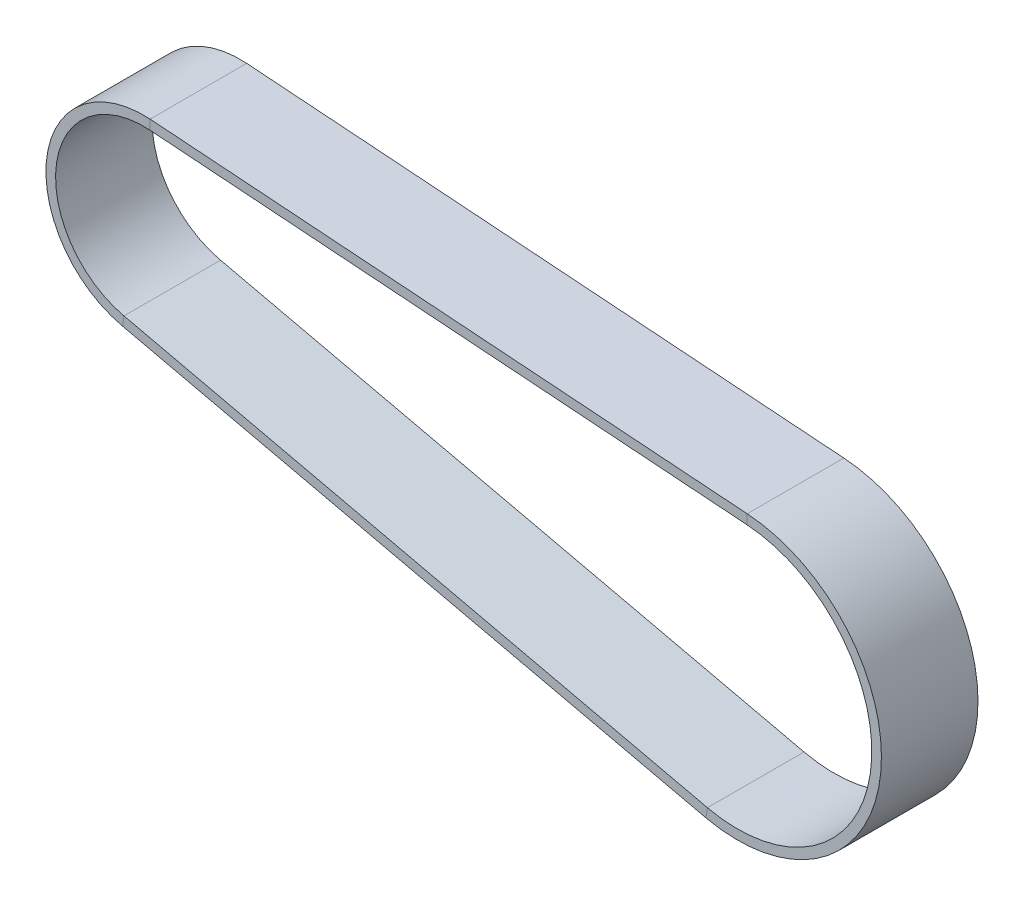
ISO-10303-21;
HEADER;
FILE_DESCRIPTION(('STEP AP214'),'2;1');
FILE_NAME('part.step','',(''),(''),'','','');
FILE_SCHEMA(('AUTOMOTIVE_DESIGN { 1 0 10303 214 1 1 1 1 }'));
ENDSEC;
DATA;
#1=APPLICATION_CONTEXT('core data for automotive mechanical design processes');
#2=APPLICATION_PROTOCOL_DEFINITION('international standard','automotive_design',2000,#1);
#3=PRODUCT_CONTEXT('',#1,'mechanical');
#4=PRODUCT('Part','Part','',(#3));
#5=PRODUCT_RELATED_PRODUCT_CATEGORY('part','',(#4));
#6=PRODUCT_DEFINITION_FORMATION('','',#4);
#7=PRODUCT_DEFINITION_CONTEXT('part definition',#1,'design');
#8=PRODUCT_DEFINITION('design','',#6,#7);
#9=PRODUCT_DEFINITION_SHAPE('','',#8);
#10=(LENGTH_UNIT() NAMED_UNIT(*) SI_UNIT(.MILLI.,.METRE.));
#11=(NAMED_UNIT(*) PLANE_ANGLE_UNIT() SI_UNIT($,.RADIAN.));
#12=(NAMED_UNIT(*) SI_UNIT($,.STERADIAN.) SOLID_ANGLE_UNIT());
#13=UNCERTAINTY_MEASURE_WITH_UNIT(LENGTH_MEASURE(1.E-05),#10,'distance_accuracy_value','');
#14=(GEOMETRIC_REPRESENTATION_CONTEXT(3) GLOBAL_UNCERTAINTY_ASSIGNED_CONTEXT((#13)) GLOBAL_UNIT_ASSIGNED_CONTEXT((#10,
#11,#12)) REPRESENTATION_CONTEXT('',''));
#15=CARTESIAN_POINT('',(0.,0.,0.));
#16=DIRECTION('',(0.,0.,1.));
#17=DIRECTION('',(1.,0.,0.));
#18=AXIS2_PLACEMENT_3D('',#15,#16,#17);
#19=CARTESIAN_POINT('',(1.33504318711175E-11,-2.84043621956442E-11,0.));
#20=DIRECTION('',(0.,0.,-1.));
#21=DIRECTION('',(-1.,0.,0.));
#22=AXIS2_PLACEMENT_3D('',#19,#20,#21);
#23=CYLINDRICAL_SURFACE('',#22,10.1276459482546);
#24=CARTESIAN_POINT('',(1.33504318711175E-11,-2.84043621956442E-11,-5.));
#25=DIRECTION('',(0.,0.,-1.));
#26=DIRECTION('',(-0.217155513280798,-0.97613702063376,0.));
#27=AXIS2_PLACEMENT_3D('',#24,#25,#26);
#28=CIRCLE('',#27,10.1276459482546);
#29=CARTESIAN_POINT('',(-2.19927415421774,-9.88597014204194,-5.));
#30=VERTEX_POINT('',#29);
#31=CARTESIAN_POINT('',(0.659407883699955,10.1061562275979,-5.));
#32=VERTEX_POINT('',#31);
#33=EDGE_CURVE('E11',#30,#32,#28,.T.);
#34=ORIENTED_EDGE('',*,*,#33,.F.);
#35=DIRECTION('',(0.,0.,1.));
#36=VECTOR('',#35,1.);
#37=CARTESIAN_POINT('',(-2.19927415420607,-9.88597014199121,5.));
#38=LINE('',#37,#36);
#39=CARTESIAN_POINT('',(-2.19927415421774,-9.88597014204193,5.));
#40=VERTEX_POINT('',#39);
#41=EDGE_CURVE('E46',#30,#40,#38,.T.);
#42=ORIENTED_EDGE('',*,*,#41,.T.);
#43=CARTESIAN_POINT('',(1.33504318711175E-11,-2.84043621956442E-11,5.));
#44=DIRECTION('',(0.,0.,-1.));
#45=DIRECTION('',(-0.217155513280799,-0.97613702063376,0.));
#46=AXIS2_PLACEMENT_3D('',#43,#44,#45);
#47=CIRCLE('',#46,10.1276459482546);
#48=CARTESIAN_POINT('',(0.659407883699955,10.1061562275979,5.));
#49=VERTEX_POINT('',#48);
#50=EDGE_CURVE('E125',#40,#49,#47,.T.);
#51=ORIENTED_EDGE('',*,*,#50,.T.);
#52=DIRECTION('',(0.,0.,1.));
#53=VECTOR('',#52,1.);
#54=CARTESIAN_POINT('',(0.659407883699955,10.1061562275979,5.));
#55=LINE('',#54,#53);
#56=EDGE_CURVE('E123',#32,#49,#55,.T.);
#57=ORIENTED_EDGE('',*,*,#56,.F.);
#58=EDGE_LOOP('',(#34,#42,#51,#57));
#59=FACE_BOUND('',#58,.T.);
#60=ADVANCED_FACE('F43',(#59),#23,.T.);
#61=CARTESIAN_POINT('',(-2.19927415420607,-9.88597014199121,-5.));
#62=DIRECTION('',(0.,0.,-1.));
#63=DIRECTION('',(-1.,0.,0.));
#64=AXIS2_PLACEMENT_3D('',#61,#62,#63);
#65=PLANE('',#64);
#66=CARTESIAN_POINT('',(1.33504318711175E-11,-2.84043621956442E-11,-5.));
#67=DIRECTION('',(0.,0.,-1.));
#68=DIRECTION('',(-0.22411121564276,-0.97456357567022,0.));
#69=AXIS2_PLACEMENT_3D('',#66,#67,#68);
#70=CIRCLE('',#69,9.12999999989343);
#71=CARTESIAN_POINT('',(-2.04613539879283,-8.89776544584438,-5.));
#72=VERTEX_POINT('',#71);
#73=CARTESIAN_POINT('',(0.659407883699955,9.10615622759785,-5.));
#74=VERTEX_POINT('',#73);
#75=EDGE_CURVE('E51',#72,#74,#70,.T.);
#76=ORIENTED_EDGE('',*,*,#75,.F.);
#77=DIRECTION('',(-0.153138755424914,-0.988204696197558,0.));
#78=VECTOR('',#77,1.);
#79=CARTESIAN_POINT('',(-2.19927415420607,-9.88597014199121,-5.));
#80=LINE('',#79,#78);
#81=EDGE_CURVE('E192',#72,#30,#80,.T.);
#82=ORIENTED_EDGE('',*,*,#81,.T.);
#83=ORIENTED_EDGE('',*,*,#33,.T.);
#84=DIRECTION('',(0.,1.,0.));
#85=VECTOR('',#84,1.);
#86=CARTESIAN_POINT('',(0.659407883699955,10.1061562275979,-5.));
#87=LINE('',#86,#85);
#88=EDGE_CURVE('E148',#74,#32,#87,.T.);
#89=ORIENTED_EDGE('',*,*,#88,.F.);
#90=EDGE_LOOP('',(#76,#82,#83,#89));
#91=FACE_BOUND('',#90,.T.);
#92=ADVANCED_FACE('F234',(#91),#65,.T.);
#93=CARTESIAN_POINT('',(1.33504318711175E-11,-2.84043621956442E-11,0.));
#94=DIRECTION('',(0.,0.,-1.));
#95=DIRECTION('',(-1.,0.,0.));
#96=AXIS2_PLACEMENT_3D('',#93,#94,#95);
#97=CYLINDRICAL_SURFACE('',#96,9.12999999989343);
#98=CARTESIAN_POINT('',(1.33504318711175E-11,-2.84043621956442E-11,5.));
#99=DIRECTION('',(0.,0.,-1.));
#100=DIRECTION('',(-0.22411121564276,-0.97456357567022,0.));
#101=AXIS2_PLACEMENT_3D('',#98,#99,#100);
#102=CIRCLE('',#101,9.12999999989343);
#103=CARTESIAN_POINT('',(-2.04613539879283,-8.89776544584438,5.));
#104=VERTEX_POINT('',#103);
#105=CARTESIAN_POINT('',(0.659407883699955,9.10615622759785,5.));
#106=VERTEX_POINT('',#105);
#107=EDGE_CURVE('E133',#104,#106,#102,.T.);
#108=ORIENTED_EDGE('',*,*,#107,.F.);
#109=DIRECTION('',(0.,0.,-1.));
#110=VECTOR('',#109,1.);
#111=CARTESIAN_POINT('',(-2.04613539878116,-8.89776544579365,5.));
#112=LINE('',#111,#110);
#113=EDGE_CURVE('E176',#104,#72,#112,.T.);
#114=ORIENTED_EDGE('',*,*,#113,.T.);
#115=ORIENTED_EDGE('',*,*,#75,.T.);
#116=DIRECTION('',(0.,0.,-1.));
#117=VECTOR('',#116,1.);
#118=CARTESIAN_POINT('',(0.659407883699955,9.10615622759785,5.));
#119=LINE('',#118,#117);
#120=EDGE_CURVE('E152',#106,#74,#119,.T.);
#121=ORIENTED_EDGE('',*,*,#120,.F.);
#122=EDGE_LOOP('',(#108,#114,#115,#121));
#123=FACE_BOUND('',#122,.T.);
#124=ADVANCED_FACE('F238',(#123),#97,.F.);
#125=CARTESIAN_POINT('',(58.2177782861639,-23.779511215972,5.));
#126=DIRECTION('',(-0.224111215639051,-0.974563575671073,0.));
#127=DIRECTION('',(0.974563575671073,-0.224111215639051,0.));
#128=AXIS2_PLACEMENT_3D('',#125,#126,#127);
#129=PLANE('',#128);
#130=ORIENTED_EDGE('',*,*,#41,.F.);
#131=DIRECTION('',(-0.974563575671073,0.224111215639051,0.));
#132=VECTOR('',#131,1.);
#133=CARTESIAN_POINT('',(58.2177782861639,-23.779511215972,-5.));
#134=LINE('',#133,#132);
#135=CARTESIAN_POINT('',(58.2177782861639,-23.779511215972,-5.));
#136=VERTEX_POINT('',#135);
#137=EDGE_CURVE('E204',#136,#30,#134,.T.);
#138=ORIENTED_EDGE('',*,*,#137,.F.);
#139=DIRECTION('',(0.,0.,1.));
#140=VECTOR('',#139,1.);
#141=CARTESIAN_POINT('',(58.2177782861639,-23.779511215972,5.));
#142=LINE('',#141,#140);
#143=CARTESIAN_POINT('',(58.2177782861639,-23.779511215972,5.));
#144=VERTEX_POINT('',#143);
#145=EDGE_CURVE('E177',#136,#144,#142,.T.);
#146=ORIENTED_EDGE('',*,*,#145,.T.);
#147=DIRECTION('',(-0.974563575671073,0.224111215639051,0.));
#148=VECTOR('',#147,1.);
#149=CARTESIAN_POINT('',(58.2177782861639,-23.779511215972,5.));
#150=LINE('',#149,#148);
#151=EDGE_CURVE('E173',#144,#40,#150,.T.);
#152=ORIENTED_EDGE('',*,*,#151,.T.);
#153=EDGE_LOOP('',(#130,#138,#146,#152));
#154=FACE_BOUND('',#153,.T.);
#155=ADVANCED_FACE('F214',(#154),#129,.T.);
#156=CARTESIAN_POINT('',(58.2177782861639,-23.779511215972,-5.));
#157=DIRECTION('',(0.,0.,-1.));
#158=DIRECTION('',(-1.,0.,0.));
#159=AXIS2_PLACEMENT_3D('',#156,#157,#158);
#160=PLANE('',#159);
#161=ORIENTED_EDGE('',*,*,#137,.T.);
#162=ORIENTED_EDGE('',*,*,#81,.F.);
#163=DIRECTION('',(-0.974563575671073,0.224111215639051,0.));
#164=VECTOR('',#163,1.);
#165=CARTESIAN_POINT('',(58.3709170415888,-22.7913065197744,-5.));
#166=LINE('',#165,#164);
#167=CARTESIAN_POINT('',(58.3709170415888,-22.7913065197744,-5.));
#168=VERTEX_POINT('',#167);
#169=EDGE_CURVE('E191',#168,#72,#166,.T.);
#170=ORIENTED_EDGE('',*,*,#169,.F.);
#171=DIRECTION('',(-0.153138755424915,-0.988204696197558,0.));
#172=VECTOR('',#171,1.);
#173=CARTESIAN_POINT('',(58.2177782861639,-23.779511215972,-5.));
#174=LINE('',#173,#172);
#175=EDGE_CURVE('E189',#168,#136,#174,.T.);
#176=ORIENTED_EDGE('',*,*,#175,.T.);
#177=EDGE_LOOP('',(#161,#162,#170,#176));
#178=FACE_BOUND('',#177,.T.);
#179=ADVANCED_FACE('F250',(#178),#160,.T.);
#180=CARTESIAN_POINT('',(58.3709170415888,-22.7913065197744,5.));
#181=DIRECTION('',(0.224111215639051,0.974563575671073,0.));
#182=DIRECTION('',(-0.974563575671073,0.224111215639051,0.));
#183=AXIS2_PLACEMENT_3D('',#180,#181,#182);
#184=PLANE('',#183);
#185=ORIENTED_EDGE('',*,*,#169,.T.);
#186=ORIENTED_EDGE('',*,*,#113,.F.);
#187=DIRECTION('',(-0.974563575671073,0.224111215639051,0.));
#188=VECTOR('',#187,1.);
#189=CARTESIAN_POINT('',(58.3709170415888,-22.7913065197744,5.));
#190=LINE('',#189,#188);
#191=CARTESIAN_POINT('',(58.3709170415888,-22.7913065197744,5.));
#192=VERTEX_POINT('',#191);
#193=EDGE_CURVE('E175',#192,#104,#190,.T.);
#194=ORIENTED_EDGE('',*,*,#193,.F.);
#195=DIRECTION('',(0.,0.,-1.));
#196=VECTOR('',#195,1.);
#197=CARTESIAN_POINT('',(58.3709170415888,-22.7913065197744,5.));
#198=LINE('',#197,#196);
#199=EDGE_CURVE('E164',#192,#168,#198,.T.);
#200=ORIENTED_EDGE('',*,*,#199,.T.);
#201=EDGE_LOOP('',(#185,#186,#194,#200));
#202=FACE_BOUND('',#201,.T.);
#203=ADVANCED_FACE('F220',(#202),#184,.T.);
#204=CARTESIAN_POINT('',(58.2177782861639,-23.779511215972,5.));
#205=DIRECTION('',(0.,0.,1.));
#206=DIRECTION('',(1.,0.,0.));
#207=AXIS2_PLACEMENT_3D('',#204,#205,#206);
#208=PLANE('',#207);
#209=ORIENTED_EDGE('',*,*,#193,.T.);
#210=DIRECTION('',(0.153138755424914,0.988204696197558,0.));
#211=VECTOR('',#210,1.);
#212=CARTESIAN_POINT('',(-2.19927415420607,-9.88597014199121,5.));
#213=LINE('',#212,#211);
#214=EDGE_CURVE('E167',#40,#104,#213,.T.);
#215=ORIENTED_EDGE('',*,*,#214,.F.);
#216=ORIENTED_EDGE('',*,*,#151,.F.);
#217=DIRECTION('',(0.153138755424915,0.988204696197558,0.));
#218=VECTOR('',#217,1.);
#219=CARTESIAN_POINT('',(58.2177782861639,-23.779511215972,5.));
#220=LINE('',#219,#218);
#221=EDGE_CURVE('E162',#144,#192,#220,.T.);
#222=ORIENTED_EDGE('',*,*,#221,.T.);
#223=EDGE_LOOP('',(#209,#215,#216,#222));
#224=FACE_BOUND('',#223,.T.);
#225=ADVANCED_FACE('F218',(#224),#208,.T.);
#226=CARTESIAN_POINT('',(61.4871834950631,-9.24000000001022,0.));
#227=DIRECTION('',(0.,0.,-1.));
#228=DIRECTION('',(-1.,0.,0.));
#229=AXIS2_PLACEMENT_3D('',#226,#227,#228);
#230=CYLINDRICAL_SURFACE('',#229,14.9025634311368);
#231=ORIENTED_EDGE('',*,*,#145,.F.);
#232=CARTESIAN_POINT('',(61.4871834950631,-9.24000000001022,-5.));
#233=DIRECTION('',(0.,0.,-1.));
#234=DIRECTION('',(0.067389676531067,0.997726731874534,0.));
#235=AXIS2_PLACEMENT_3D('',#232,#233,#234);
#236=CIRCLE('',#235,14.9025634311368);
#237=CARTESIAN_POINT('',(62.4914624241711,5.62868590869084,-5.));
#238=VERTEX_POINT('',#237);
#239=EDGE_CURVE('E89',#238,#136,#236,.T.);
#240=ORIENTED_EDGE('',*,*,#239,.F.);
#241=DIRECTION('',(0.,0.,1.));
#242=VECTOR('',#241,1.);
#243=CARTESIAN_POINT('',(62.4914624241711,5.62868590869084,5.));
#244=LINE('',#243,#242);
#245=CARTESIAN_POINT('',(62.4914624241711,5.62868590869084,5.));
#246=VERTEX_POINT('',#245);
#247=EDGE_CURVE('E169',#238,#246,#244,.T.);
#248=ORIENTED_EDGE('',*,*,#247,.T.);
#249=CARTESIAN_POINT('',(61.4871834950631,-9.24000000001022,5.));
#250=DIRECTION('',(0.,0.,-1.));
#251=DIRECTION('',(0.067389676531067,0.997726731874534,0.));
#252=AXIS2_PLACEMENT_3D('',#249,#250,#251);
#253=CIRCLE('',#252,14.9025634311368);
#254=EDGE_CURVE('E170',#246,#144,#253,.T.);
#255=ORIENTED_EDGE('',*,*,#254,.T.);
#256=EDGE_LOOP('',(#231,#240,#248,#255));
#257=FACE_BOUND('',#256,.T.);
#258=ADVANCED_FACE('F230',(#257),#230,.T.);
#259=CARTESIAN_POINT('',(62.4914624241711,5.62868590869084,-5.));
#260=DIRECTION('',(0.,0.,-1.));
#261=DIRECTION('',(-1.,0.,0.));
#262=AXIS2_PLACEMENT_3D('',#259,#260,#261);
#263=PLANE('',#262);
#264=ORIENTED_EDGE('',*,*,#239,.T.);
#265=ORIENTED_EDGE('',*,*,#175,.F.);
#266=CARTESIAN_POINT('',(61.4871834950631,-9.24000000001022,-5.));
#267=DIRECTION('',(0.,0.,-1.));
#268=DIRECTION('',(0.072224302704331,0.997388414860967,0.));
#269=AXIS2_PLACEMENT_3D('',#266,#267,#268);
#270=CIRCLE('',#269,13.9050000000595);
#271=CARTESIAN_POINT('',(62.4914624241711,4.62868590869084,-5.));
#272=VERTEX_POINT('',#271);
#273=EDGE_CURVE('E97',#272,#168,#270,.T.);
#274=ORIENTED_EDGE('',*,*,#273,.F.);
#275=DIRECTION('',(0.,1.,0.));
#276=VECTOR('',#275,1.);
#277=CARTESIAN_POINT('',(62.4914624241711,5.62868590869084,-5.));
#278=LINE('',#277,#276);
#279=EDGE_CURVE('E184',#272,#238,#278,.T.);
#280=ORIENTED_EDGE('',*,*,#279,.T.);
#281=EDGE_LOOP('',(#264,#265,#274,#280));
#282=FACE_BOUND('',#281,.T.);
#283=ADVANCED_FACE('F225',(#282),#263,.T.);
#284=CARTESIAN_POINT('',(61.4871834950631,-9.24000000001022,0.));
#285=DIRECTION('',(0.,0.,-1.));
#286=DIRECTION('',(-1.,0.,0.));
#287=AXIS2_PLACEMENT_3D('',#284,#285,#286);
#288=CYLINDRICAL_SURFACE('',#287,13.9050000000595);
#289=ORIENTED_EDGE('',*,*,#273,.T.);
#290=ORIENTED_EDGE('',*,*,#199,.F.);
#291=CARTESIAN_POINT('',(61.4871834950631,-9.24000000001022,5.));
#292=DIRECTION('',(0.,0.,-1.));
#293=DIRECTION('',(0.072224302704331,0.997388414860967,0.));
#294=AXIS2_PLACEMENT_3D('',#291,#292,#293);
#295=CIRCLE('',#294,13.9050000000595);
#296=CARTESIAN_POINT('',(62.4914624241711,4.62868590869084,5.));
#297=VERTEX_POINT('',#296);
#298=EDGE_CURVE('E102',#297,#192,#295,.T.);
#299=ORIENTED_EDGE('',*,*,#298,.F.);
#300=DIRECTION('',(0.,0.,-1.));
#301=VECTOR('',#300,1.);
#302=CARTESIAN_POINT('',(62.4914624241711,4.62868590869084,5.));
#303=LINE('',#302,#301);
#304=EDGE_CURVE('E156',#297,#272,#303,.T.);
#305=ORIENTED_EDGE('',*,*,#304,.T.);
#306=EDGE_LOOP('',(#289,#290,#299,#305));
#307=FACE_BOUND('',#306,.T.);
#308=ADVANCED_FACE('F216',(#307),#288,.F.);
#309=CARTESIAN_POINT('',(62.4914624241711,5.62868590869084,5.));
#310=DIRECTION('',(0.,0.,1.));
#311=DIRECTION('',(1.,0.,0.));
#312=AXIS2_PLACEMENT_3D('',#309,#310,#311);
#313=PLANE('',#312);
#314=ORIENTED_EDGE('',*,*,#298,.T.);
#315=ORIENTED_EDGE('',*,*,#221,.F.);
#316=ORIENTED_EDGE('',*,*,#254,.F.);
#317=DIRECTION('',(0.,-1.,0.));
#318=VECTOR('',#317,1.);
#319=CARTESIAN_POINT('',(62.4914624241711,5.62868590869084,5.));
#320=LINE('',#319,#318);
#321=EDGE_CURVE('E142',#246,#297,#320,.T.);
#322=ORIENTED_EDGE('',*,*,#321,.T.);
#323=EDGE_LOOP('',(#314,#315,#316,#322));
#324=FACE_BOUND('',#323,.T.);
#325=ADVANCED_FACE('F213',(#324),#313,.T.);
#326=CARTESIAN_POINT('',(0.659407883699955,10.1061562275979,5.));
#327=DIRECTION('',(0.072224302704331,0.997388414860967,0.));
#328=DIRECTION('',(-0.997388414860968,0.072224302704331,0.));
#329=AXIS2_PLACEMENT_3D('',#326,#327,#328);
#330=PLANE('',#329);
#331=ORIENTED_EDGE('',*,*,#247,.F.);
#332=DIRECTION('',(0.997388414860967,-0.072224302704331,0.));
#333=VECTOR('',#332,1.);
#334=CARTESIAN_POINT('',(0.659407883699955,10.1061562275979,-5.));
#335=LINE('',#334,#333);
#336=EDGE_CURVE('E150',#32,#238,#335,.T.);
#337=ORIENTED_EDGE('',*,*,#336,.F.);
#338=ORIENTED_EDGE('',*,*,#56,.T.);
#339=DIRECTION('',(0.997388414860967,-0.072224302704331,0.));
#340=VECTOR('',#339,1.);
#341=CARTESIAN_POINT('',(0.659407883699955,10.1061562275979,5.));
#342=LINE('',#341,#340);
#343=EDGE_CURVE('E140',#49,#246,#342,.T.);
#344=ORIENTED_EDGE('',*,*,#343,.T.);
#345=EDGE_LOOP('',(#331,#337,#338,#344));
#346=FACE_BOUND('',#345,.T.);
#347=ADVANCED_FACE('F149',(#346),#330,.T.);
#348=CARTESIAN_POINT('',(0.659407883699955,10.1061562275979,-5.));
#349=DIRECTION('',(0.,0.,-1.));
#350=DIRECTION('',(-1.,0.,0.));
#351=AXIS2_PLACEMENT_3D('',#348,#349,#350);
#352=PLANE('',#351);
#353=ORIENTED_EDGE('',*,*,#336,.T.);
#354=ORIENTED_EDGE('',*,*,#279,.F.);
#355=DIRECTION('',(0.997388414860967,-0.072224302704331,0.));
#356=VECTOR('',#355,1.);
#357=CARTESIAN_POINT('',(0.659407883699955,9.10615622759785,-5.));
#358=LINE('',#357,#356);
#359=EDGE_CURVE('E185',#74,#272,#358,.T.);
#360=ORIENTED_EDGE('',*,*,#359,.F.);
#361=ORIENTED_EDGE('',*,*,#88,.T.);
#362=EDGE_LOOP('',(#353,#354,#360,#361));
#363=FACE_BOUND('',#362,.T.);
#364=ADVANCED_FACE('F249',(#363),#352,.T.);
#365=CARTESIAN_POINT('',(0.659407883699955,9.10615622759785,5.));
#366=DIRECTION('',(-0.072224302704331,-0.997388414860967,0.));
#367=DIRECTION('',(0.997388414860968,-0.072224302704331,0.));
#368=AXIS2_PLACEMENT_3D('',#365,#366,#367);
#369=PLANE('',#368);
#370=ORIENTED_EDGE('',*,*,#359,.T.);
#371=ORIENTED_EDGE('',*,*,#304,.F.);
#372=DIRECTION('',(0.997388414860967,-0.072224302704331,0.));
#373=VECTOR('',#372,1.);
#374=CARTESIAN_POINT('',(0.659407883699955,9.10615622759785,5.));
#375=LINE('',#374,#373);
#376=EDGE_CURVE('E159',#106,#297,#375,.T.);
#377=ORIENTED_EDGE('',*,*,#376,.F.);
#378=ORIENTED_EDGE('',*,*,#120,.T.);
#379=EDGE_LOOP('',(#370,#371,#377,#378));
#380=FACE_BOUND('',#379,.T.);
#381=ADVANCED_FACE('F265',(#380),#369,.T.);
#382=CARTESIAN_POINT('',(0.659407883699955,10.1061562275979,5.));
#383=DIRECTION('',(0.,0.,1.));
#384=DIRECTION('',(1.,0.,0.));
#385=AXIS2_PLACEMENT_3D('',#382,#383,#384);
#386=PLANE('',#385);
#387=ORIENTED_EDGE('',*,*,#376,.T.);
#388=ORIENTED_EDGE('',*,*,#321,.F.);
#389=ORIENTED_EDGE('',*,*,#343,.F.);
#390=DIRECTION('',(0.,-1.,0.));
#391=VECTOR('',#390,1.);
#392=CARTESIAN_POINT('',(0.659407883699955,10.1061562275979,5.));
#393=LINE('',#392,#391);
#394=EDGE_CURVE('E136',#49,#106,#393,.T.);
#395=ORIENTED_EDGE('',*,*,#394,.T.);
#396=EDGE_LOOP('',(#387,#388,#389,#395));
#397=FACE_BOUND('',#396,.T.);
#398=ADVANCED_FACE('F139',(#397),#386,.T.);
#399=CARTESIAN_POINT('',(-2.19927415420607,-9.88597014199121,5.));
#400=DIRECTION('',(0.,0.,1.));
#401=DIRECTION('',(1.,0.,0.));
#402=AXIS2_PLACEMENT_3D('',#399,#400,#401);
#403=PLANE('',#402);
#404=ORIENTED_EDGE('',*,*,#214,.T.);
#405=ORIENTED_EDGE('',*,*,#107,.T.);
#406=ORIENTED_EDGE('',*,*,#394,.F.);
#407=ORIENTED_EDGE('',*,*,#50,.F.);
#408=EDGE_LOOP('',(#404,#405,#406,#407));
#409=FACE_BOUND('',#408,.T.);
#410=ADVANCED_FACE('F153',(#409),#403,.T.);
#411=CLOSED_SHELL('',(#60,#92,#124,#155,#179,#203,#225,#258,#283,#308,#325,#347,#364,#381,#398,#410));
#412=MANIFOLD_SOLID_BREP('B2',#411);
#413=ADVANCED_BREP_SHAPE_REPRESENTATION('',(#18,#412),#14);
#414=SHAPE_DEFINITION_REPRESENTATION(#9,#413);
ENDSEC;
END-ISO-10303-21;
